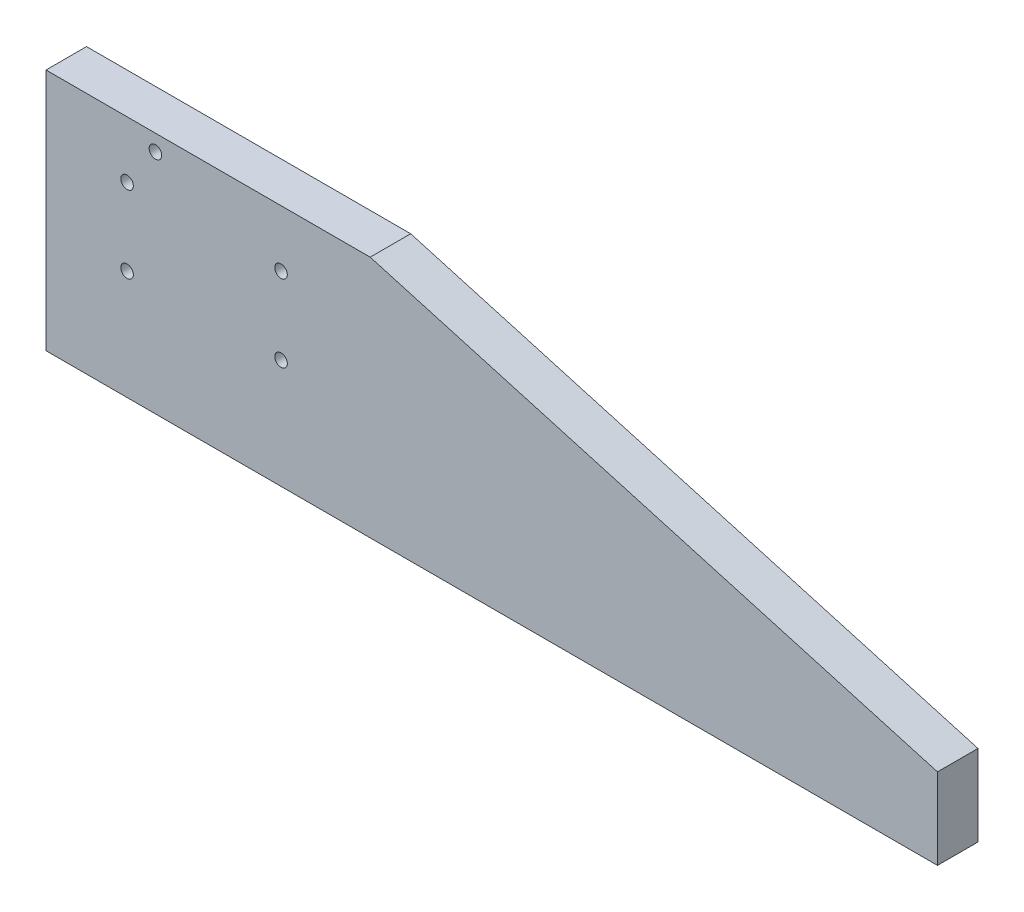
ISO-10303-21;
HEADER;
FILE_DESCRIPTION(('STEP AP214'),'2;1');
FILE_NAME('part.step','',(''),(''),'','','');
FILE_SCHEMA(('AUTOMOTIVE_DESIGN { 1 0 10303 214 1 1 1 1 }'));
ENDSEC;
DATA;
#1=APPLICATION_CONTEXT('core data for automotive mechanical design processes');
#2=APPLICATION_PROTOCOL_DEFINITION('international standard','automotive_design',2000,#1);
#3=PRODUCT_CONTEXT('',#1,'mechanical');
#4=PRODUCT('Part','Part','',(#3));
#5=PRODUCT_RELATED_PRODUCT_CATEGORY('part','',(#4));
#6=PRODUCT_DEFINITION_FORMATION('','',#4);
#7=PRODUCT_DEFINITION_CONTEXT('part definition',#1,'design');
#8=PRODUCT_DEFINITION('design','',#6,#7);
#9=PRODUCT_DEFINITION_SHAPE('','',#8);
#10=(LENGTH_UNIT() NAMED_UNIT(*) SI_UNIT(.MILLI.,.METRE.));
#11=(NAMED_UNIT(*) PLANE_ANGLE_UNIT() SI_UNIT($,.RADIAN.));
#12=(NAMED_UNIT(*) SI_UNIT($,.STERADIAN.) SOLID_ANGLE_UNIT());
#13=UNCERTAINTY_MEASURE_WITH_UNIT(LENGTH_MEASURE(1.E-05),#10,'distance_accuracy_value','');
#14=(GEOMETRIC_REPRESENTATION_CONTEXT(3) GLOBAL_UNCERTAINTY_ASSIGNED_CONTEXT((#13)) GLOBAL_UNIT_ASSIGNED_CONTEXT((#10,
#11,#12)) REPRESENTATION_CONTEXT('',''));
#15=CARTESIAN_POINT('',(0.,0.,0.));
#16=DIRECTION('',(0.,0.,1.));
#17=DIRECTION('',(1.,0.,0.));
#18=AXIS2_PLACEMENT_3D('',#15,#16,#17);
#19=CARTESIAN_POINT('',(0.,-30.,10.));
#20=DIRECTION('',(0.,1.,0.));
#21=DIRECTION('',(0.,0.,1.));
#22=AXIS2_PLACEMENT_3D('',#19,#20,#21);
#23=PLANE('',#22);
#24=DIRECTION('',(1.,0.,0.));
#25=VECTOR('',#24,1.);
#26=CARTESIAN_POINT('',(0.,-30.,0.));
#27=LINE('',#26,#25);
#28=CARTESIAN_POINT('',(-110.,-30.,0.));
#29=VERTEX_POINT('',#28);
#30=CARTESIAN_POINT('',(110.,-30.,0.));
#31=VERTEX_POINT('',#30);
#32=EDGE_CURVE('E111',#29,#31,#27,.T.);
#33=ORIENTED_EDGE('',*,*,#32,.T.);
#34=DIRECTION('',(0.,0.,-1.));
#35=VECTOR('',#34,1.);
#36=CARTESIAN_POINT('',(110.,-30.,10.));
#37=LINE('',#36,#35);
#38=CARTESIAN_POINT('',(110.,-30.,10.));
#39=VERTEX_POINT('',#38);
#40=EDGE_CURVE('E11',#39,#31,#37,.T.);
#41=ORIENTED_EDGE('',*,*,#40,.F.);
#42=DIRECTION('',(1.,0.,0.));
#43=VECTOR('',#42,1.);
#44=CARTESIAN_POINT('',(0.,-30.,10.));
#45=LINE('',#44,#43);
#46=CARTESIAN_POINT('',(-110.,-30.,10.));
#47=VERTEX_POINT('',#46);
#48=EDGE_CURVE('E122',#47,#39,#45,.T.);
#49=ORIENTED_EDGE('',*,*,#48,.F.);
#50=DIRECTION('',(0.,0.,-1.));
#51=VECTOR('',#50,1.);
#52=CARTESIAN_POINT('',(-110.,-30.,10.));
#53=LINE('',#52,#51);
#54=EDGE_CURVE('E52',#47,#29,#53,.T.);
#55=ORIENTED_EDGE('',*,*,#54,.T.);
#56=EDGE_LOOP('',(#33,#41,#49,#55));
#57=FACE_BOUND('',#56,.T.);
#58=ADVANCED_FACE('F36',(#57),#23,.F.);
#59=CARTESIAN_POINT('',(110.,0.,10.));
#60=DIRECTION('',(-1.,0.,0.));
#61=DIRECTION('',(0.,0.,1.));
#62=AXIS2_PLACEMENT_3D('',#59,#60,#61);
#63=PLANE('',#62);
#64=DIRECTION('',(0.,1.,0.));
#65=VECTOR('',#64,1.);
#66=CARTESIAN_POINT('',(110.,0.,0.));
#67=LINE('',#66,#65);
#68=CARTESIAN_POINT('',(110.,-10.,0.));
#69=VERTEX_POINT('',#68);
#70=EDGE_CURVE('E113',#31,#69,#67,.T.);
#71=ORIENTED_EDGE('',*,*,#70,.T.);
#72=DIRECTION('',(0.,0.,-1.));
#73=VECTOR('',#72,1.);
#74=CARTESIAN_POINT('',(110.,-10.,10.));
#75=LINE('',#74,#73);
#76=CARTESIAN_POINT('',(110.,-10.,10.));
#77=VERTEX_POINT('',#76);
#78=EDGE_CURVE('E44',#77,#69,#75,.T.);
#79=ORIENTED_EDGE('',*,*,#78,.F.);
#80=DIRECTION('',(0.,1.,0.));
#81=VECTOR('',#80,1.);
#82=CARTESIAN_POINT('',(110.,0.,10.));
#83=LINE('',#82,#81);
#84=EDGE_CURVE('E81',#39,#77,#83,.T.);
#85=ORIENTED_EDGE('',*,*,#84,.F.);
#86=ORIENTED_EDGE('',*,*,#40,.T.);
#87=EDGE_LOOP('',(#71,#79,#85,#86));
#88=FACE_BOUND('',#87,.T.);
#89=ADVANCED_FACE('F138',(#88),#63,.F.);
#90=CARTESIAN_POINT('',(5.66037735849057,19.811320754717,10.));
#91=DIRECTION('',(-0.274721127897378,-0.961523947640823,0.));
#92=DIRECTION('',(0.961523947640823,-0.274721127897378,0.));
#93=AXIS2_PLACEMENT_3D('',#90,#91,#92);
#94=PLANE('',#93);
#95=DIRECTION('',(-0.961523947640823,0.274721127897378,0.));
#96=VECTOR('',#95,1.);
#97=CARTESIAN_POINT('',(5.66037735849057,19.811320754717,0.));
#98=LINE('',#97,#96);
#99=CARTESIAN_POINT('',(-29.9999999999999,30.,0.));
#100=VERTEX_POINT('',#99);
#101=EDGE_CURVE('E101',#69,#100,#98,.T.);
#102=ORIENTED_EDGE('',*,*,#101,.T.);
#103=DIRECTION('',(0.,0.,-1.));
#104=VECTOR('',#103,1.);
#105=CARTESIAN_POINT('',(-29.9999999999999,30.,10.));
#106=LINE('',#105,#104);
#107=CARTESIAN_POINT('',(-29.9999999999999,30.,10.));
#108=VERTEX_POINT('',#107);
#109=EDGE_CURVE('E98',#108,#100,#106,.T.);
#110=ORIENTED_EDGE('',*,*,#109,.F.);
#111=DIRECTION('',(-0.961523947640823,0.274721127897378,0.));
#112=VECTOR('',#111,1.);
#113=CARTESIAN_POINT('',(5.66037735849057,19.811320754717,10.));
#114=LINE('',#113,#112);
#115=EDGE_CURVE('E88',#77,#108,#114,.T.);
#116=ORIENTED_EDGE('',*,*,#115,.F.);
#117=ORIENTED_EDGE('',*,*,#78,.T.);
#118=EDGE_LOOP('',(#102,#110,#116,#117));
#119=FACE_BOUND('',#118,.T.);
#120=ADVANCED_FACE('F99',(#119),#94,.F.);
#121=CARTESIAN_POINT('',(0.,30.,10.));
#122=DIRECTION('',(0.,1.,0.));
#123=DIRECTION('',(0.,0.,1.));
#124=AXIS2_PLACEMENT_3D('',#121,#122,#123);
#125=PLANE('',#124);
#126=DIRECTION('',(1.,0.,0.));
#127=VECTOR('',#126,1.);
#128=CARTESIAN_POINT('',(0.,30.,0.));
#129=LINE('',#128,#127);
#130=CARTESIAN_POINT('',(-110.,30.,0.));
#131=VERTEX_POINT('',#130);
#132=EDGE_CURVE('E117',#131,#100,#129,.T.);
#133=ORIENTED_EDGE('',*,*,#132,.F.);
#134=DIRECTION('',(0.,0.,-1.));
#135=VECTOR('',#134,1.);
#136=CARTESIAN_POINT('',(-110.,30.,10.));
#137=LINE('',#136,#135);
#138=CARTESIAN_POINT('',(-110.,30.,10.));
#139=VERTEX_POINT('',#138);
#140=EDGE_CURVE('E69',#139,#131,#137,.T.);
#141=ORIENTED_EDGE('',*,*,#140,.F.);
#142=DIRECTION('',(1.,0.,0.));
#143=VECTOR('',#142,1.);
#144=CARTESIAN_POINT('',(0.,30.,10.));
#145=LINE('',#144,#143);
#146=EDGE_CURVE('E93',#139,#108,#145,.T.);
#147=ORIENTED_EDGE('',*,*,#146,.T.);
#148=ORIENTED_EDGE('',*,*,#109,.T.);
#149=EDGE_LOOP('',(#133,#141,#147,#148));
#150=FACE_BOUND('',#149,.T.);
#151=ADVANCED_FACE('F105',(#150),#125,.T.);
#152=CARTESIAN_POINT('',(-110.,0.,10.));
#153=DIRECTION('',(-1.,0.,0.));
#154=DIRECTION('',(0.,0.,1.));
#155=AXIS2_PLACEMENT_3D('',#152,#153,#154);
#156=PLANE('',#155);
#157=DIRECTION('',(0.,1.,0.));
#158=VECTOR('',#157,1.);
#159=CARTESIAN_POINT('',(-110.,0.,0.));
#160=LINE('',#159,#158);
#161=EDGE_CURVE('E119',#29,#131,#160,.T.);
#162=ORIENTED_EDGE('',*,*,#161,.F.);
#163=ORIENTED_EDGE('',*,*,#54,.F.);
#164=DIRECTION('',(0.,1.,0.));
#165=VECTOR('',#164,1.);
#166=CARTESIAN_POINT('',(-110.,0.,10.));
#167=LINE('',#166,#165);
#168=EDGE_CURVE('E106',#47,#139,#167,.T.);
#169=ORIENTED_EDGE('',*,*,#168,.T.);
#170=ORIENTED_EDGE('',*,*,#140,.T.);
#171=EDGE_LOOP('',(#162,#163,#169,#170));
#172=FACE_BOUND('',#171,.T.);
#173=ADVANCED_FACE('F126',(#172),#156,.T.);
#174=CARTESIAN_POINT('',(0.,0.,10.));
#175=DIRECTION('',(0.,0.,1.));
#176=DIRECTION('',(1.,0.,0.));
#177=AXIS2_PLACEMENT_3D('',#174,#175,#176);
#178=PLANE('',#177);
#179=CARTESIAN_POINT('',(-82.9999999999999,26.,10.));
#180=DIRECTION('',(0.,0.,1.));
#181=DIRECTION('',(1.,0.,0.));
#182=AXIS2_PLACEMENT_3D('',#179,#180,#181);
#183=CIRCLE('',#182,1.55000000000001);
#184=CARTESIAN_POINT('',(-81.4499999999999,26.,10.));
#185=VERTEX_POINT('',#184);
#186=EDGE_CURVE('E171',#185,#185,#183,.T.);
#187=ORIENTED_EDGE('',*,*,#186,.F.);
#188=EDGE_LOOP('',(#187));
#189=FACE_BOUND('',#188,.T.);
#190=CARTESIAN_POINT('',(-51.9999999999999,16.,10.));
#191=DIRECTION('',(0.,0.,1.));
#192=DIRECTION('',(1.,0.,0.));
#193=AXIS2_PLACEMENT_3D('',#190,#191,#192);
#194=CIRCLE('',#193,1.54999999999999);
#195=CARTESIAN_POINT('',(-50.4499999999999,16.,10.));
#196=VERTEX_POINT('',#195);
#197=EDGE_CURVE('E158',#196,#196,#194,.T.);
#198=ORIENTED_EDGE('',*,*,#197,.F.);
#199=EDGE_LOOP('',(#198));
#200=FACE_BOUND('',#199,.T.);
#201=CARTESIAN_POINT('',(-89.9999999999999,-3.,10.));
#202=DIRECTION('',(0.,0.,1.));
#203=DIRECTION('',(1.,0.,0.));
#204=AXIS2_PLACEMENT_3D('',#201,#202,#203);
#205=CIRCLE('',#204,1.55000000000001);
#206=CARTESIAN_POINT('',(-88.4499999999999,-3.,10.));
#207=VERTEX_POINT('',#206);
#208=EDGE_CURVE('E151',#207,#207,#205,.T.);
#209=ORIENTED_EDGE('',*,*,#208,.F.);
#210=EDGE_LOOP('',(#209));
#211=FACE_BOUND('',#210,.T.);
#212=CARTESIAN_POINT('',(-51.9999999999999,-3.,10.));
#213=DIRECTION('',(0.,0.,1.));
#214=DIRECTION('',(1.,0.,0.));
#215=AXIS2_PLACEMENT_3D('',#212,#213,#214);
#216=CIRCLE('',#215,1.54999999999999);
#217=CARTESIAN_POINT('',(-50.4499999999999,-3.,10.));
#218=VERTEX_POINT('',#217);
#219=EDGE_CURVE('E163',#218,#218,#216,.T.);
#220=ORIENTED_EDGE('',*,*,#219,.F.);
#221=EDGE_LOOP('',(#220));
#222=FACE_BOUND('',#221,.T.);
#223=CARTESIAN_POINT('',(-89.9999999999999,16.,10.));
#224=DIRECTION('',(0.,0.,1.));
#225=DIRECTION('',(1.,0.,0.));
#226=AXIS2_PLACEMENT_3D('',#223,#224,#225);
#227=CIRCLE('',#226,1.55000000000001);
#228=CARTESIAN_POINT('',(-88.4499999999999,16.,10.));
#229=VERTEX_POINT('',#228);
#230=EDGE_CURVE('E145',#229,#229,#227,.T.);
#231=ORIENTED_EDGE('',*,*,#230,.F.);
#232=EDGE_LOOP('',(#231));
#233=FACE_BOUND('',#232,.T.);
#234=ORIENTED_EDGE('',*,*,#48,.T.);
#235=ORIENTED_EDGE('',*,*,#84,.T.);
#236=ORIENTED_EDGE('',*,*,#115,.T.);
#237=ORIENTED_EDGE('',*,*,#146,.F.);
#238=ORIENTED_EDGE('',*,*,#168,.F.);
#239=EDGE_LOOP('',(#234,#235,#236,#237,#238));
#240=FACE_BOUND('',#239,.T.);
#241=ADVANCED_FACE('F90',(#189,#200,#211,#222,#233,#240),#178,.T.);
#242=CARTESIAN_POINT('',(0.,0.,0.));
#243=DIRECTION('',(0.,0.,1.));
#244=DIRECTION('',(1.,0.,0.));
#245=AXIS2_PLACEMENT_3D('',#242,#243,#244);
#246=PLANE('',#245);
#247=CARTESIAN_POINT('',(-82.9999999999999,26.,0.));
#248=DIRECTION('',(0.,0.,1.));
#249=DIRECTION('',(1.,0.,0.));
#250=AXIS2_PLACEMENT_3D('',#247,#248,#249);
#251=CIRCLE('',#250,1.55000000000001);
#252=CARTESIAN_POINT('',(-81.4499999999999,26.,0.));
#253=VERTEX_POINT('',#252);
#254=EDGE_CURVE('E166',#253,#253,#251,.F.);
#255=ORIENTED_EDGE('',*,*,#254,.F.);
#256=EDGE_LOOP('',(#255));
#257=FACE_BOUND('',#256,.T.);
#258=CARTESIAN_POINT('',(-51.9999999999999,16.,0.));
#259=DIRECTION('',(0.,0.,1.));
#260=DIRECTION('',(1.,0.,0.));
#261=AXIS2_PLACEMENT_3D('',#258,#259,#260);
#262=CIRCLE('',#261,1.54999999999999);
#263=CARTESIAN_POINT('',(-50.4499999999999,16.,0.));
#264=VERTEX_POINT('',#263);
#265=EDGE_CURVE('E148',#264,#264,#262,.T.);
#266=ORIENTED_EDGE('',*,*,#265,.T.);
#267=EDGE_LOOP('',(#266));
#268=FACE_BOUND('',#267,.T.);
#269=CARTESIAN_POINT('',(-89.9999999999999,-3.,0.));
#270=DIRECTION('',(0.,0.,1.));
#271=DIRECTION('',(1.,0.,0.));
#272=AXIS2_PLACEMENT_3D('',#269,#270,#271);
#273=CIRCLE('',#272,1.55000000000001);
#274=CARTESIAN_POINT('',(-88.4499999999999,-3.,0.));
#275=VERTEX_POINT('',#274);
#276=EDGE_CURVE('E154',#275,#275,#273,.T.);
#277=ORIENTED_EDGE('',*,*,#276,.T.);
#278=EDGE_LOOP('',(#277));
#279=FACE_BOUND('',#278,.T.);
#280=CARTESIAN_POINT('',(-51.9999999999999,-3.,0.));
#281=DIRECTION('',(0.,0.,1.));
#282=DIRECTION('',(1.,0.,0.));
#283=AXIS2_PLACEMENT_3D('',#280,#281,#282);
#284=CIRCLE('',#283,1.54999999999999);
#285=CARTESIAN_POINT('',(-50.4499999999999,-3.,0.));
#286=VERTEX_POINT('',#285);
#287=EDGE_CURVE('E155',#286,#286,#284,.T.);
#288=ORIENTED_EDGE('',*,*,#287,.T.);
#289=EDGE_LOOP('',(#288));
#290=FACE_BOUND('',#289,.T.);
#291=CARTESIAN_POINT('',(-89.9999999999999,16.,0.));
#292=DIRECTION('',(0.,0.,1.));
#293=DIRECTION('',(1.,0.,0.));
#294=AXIS2_PLACEMENT_3D('',#291,#292,#293);
#295=CIRCLE('',#294,1.55000000000001);
#296=CARTESIAN_POINT('',(-88.4499999999999,16.,0.));
#297=VERTEX_POINT('',#296);
#298=EDGE_CURVE('E114',#297,#297,#295,.T.);
#299=ORIENTED_EDGE('',*,*,#298,.T.);
#300=EDGE_LOOP('',(#299));
#301=FACE_BOUND('',#300,.T.);
#302=ORIENTED_EDGE('',*,*,#32,.F.);
#303=ORIENTED_EDGE('',*,*,#161,.T.);
#304=ORIENTED_EDGE('',*,*,#132,.T.);
#305=ORIENTED_EDGE('',*,*,#101,.F.);
#306=ORIENTED_EDGE('',*,*,#70,.F.);
#307=EDGE_LOOP('',(#302,#303,#304,#305,#306));
#308=FACE_BOUND('',#307,.T.);
#309=ADVANCED_FACE('F125',(#257,#268,#279,#290,#301,#308),#246,.F.);
#310=CARTESIAN_POINT('',(-89.9999999999999,16.,0.));
#311=DIRECTION('',(0.,0.,1.));
#312=DIRECTION('',(1.,0.,0.));
#313=AXIS2_PLACEMENT_3D('',#310,#311,#312);
#314=CYLINDRICAL_SURFACE('',#313,1.55000000000001);
#315=ORIENTED_EDGE('',*,*,#298,.F.);
#316=EDGE_LOOP('',(#315));
#317=FACE_BOUND('',#316,.T.);
#318=ORIENTED_EDGE('',*,*,#230,.T.);
#319=EDGE_LOOP('',(#318));
#320=FACE_BOUND('',#319,.T.);
#321=ADVANCED_FACE('F186',(#317,#320),#314,.F.);
#322=CARTESIAN_POINT('',(-51.9999999999999,-3.,0.));
#323=DIRECTION('',(0.,0.,1.));
#324=DIRECTION('',(1.,0.,0.));
#325=AXIS2_PLACEMENT_3D('',#322,#323,#324);
#326=CYLINDRICAL_SURFACE('',#325,1.54999999999999);
#327=ORIENTED_EDGE('',*,*,#287,.F.);
#328=EDGE_LOOP('',(#327));
#329=FACE_BOUND('',#328,.T.);
#330=ORIENTED_EDGE('',*,*,#219,.T.);
#331=EDGE_LOOP('',(#330));
#332=FACE_BOUND('',#331,.T.);
#333=ADVANCED_FACE('F188',(#329,#332),#326,.F.);
#334=CARTESIAN_POINT('',(-89.9999999999999,-3.,0.));
#335=DIRECTION('',(0.,0.,1.));
#336=DIRECTION('',(1.,0.,0.));
#337=AXIS2_PLACEMENT_3D('',#334,#335,#336);
#338=CYLINDRICAL_SURFACE('',#337,1.55000000000001);
#339=ORIENTED_EDGE('',*,*,#276,.F.);
#340=EDGE_LOOP('',(#339));
#341=FACE_BOUND('',#340,.T.);
#342=ORIENTED_EDGE('',*,*,#208,.T.);
#343=EDGE_LOOP('',(#342));
#344=FACE_BOUND('',#343,.T.);
#345=ADVANCED_FACE('F195',(#341,#344),#338,.F.);
#346=CARTESIAN_POINT('',(-51.9999999999999,16.,0.));
#347=DIRECTION('',(0.,0.,1.));
#348=DIRECTION('',(1.,0.,0.));
#349=AXIS2_PLACEMENT_3D('',#346,#347,#348);
#350=CYLINDRICAL_SURFACE('',#349,1.54999999999999);
#351=ORIENTED_EDGE('',*,*,#265,.F.);
#352=EDGE_LOOP('',(#351));
#353=FACE_BOUND('',#352,.T.);
#354=ORIENTED_EDGE('',*,*,#197,.T.);
#355=EDGE_LOOP('',(#354));
#356=FACE_BOUND('',#355,.T.);
#357=ADVANCED_FACE('F203',(#353,#356),#350,.F.);
#358=CARTESIAN_POINT('',(-82.9999999999999,26.,-0.000999999999999265));
#359=DIRECTION('',(0.,0.,1.));
#360=DIRECTION('',(1.,0.,0.));
#361=AXIS2_PLACEMENT_3D('',#358,#359,#360);
#362=CYLINDRICAL_SURFACE('',#361,1.55000000000001);
#363=ORIENTED_EDGE('',*,*,#186,.T.);
#364=EDGE_LOOP('',(#363));
#365=FACE_BOUND('',#364,.T.);
#366=ORIENTED_EDGE('',*,*,#254,.T.);
#367=EDGE_LOOP('',(#366));
#368=FACE_BOUND('',#367,.T.);
#369=ADVANCED_FACE('F175',(#365,#368),#362,.F.);
#370=CLOSED_SHELL('',(#58,#89,#120,#151,#173,#241,#309,#321,#333,#345,#357,#369));
#371=MANIFOLD_SOLID_BREP('B2',#370);
#372=ADVANCED_BREP_SHAPE_REPRESENTATION('',(#18,#371),#14);
#373=SHAPE_DEFINITION_REPRESENTATION(#9,#372);
ENDSEC;
END-ISO-10303-21;
